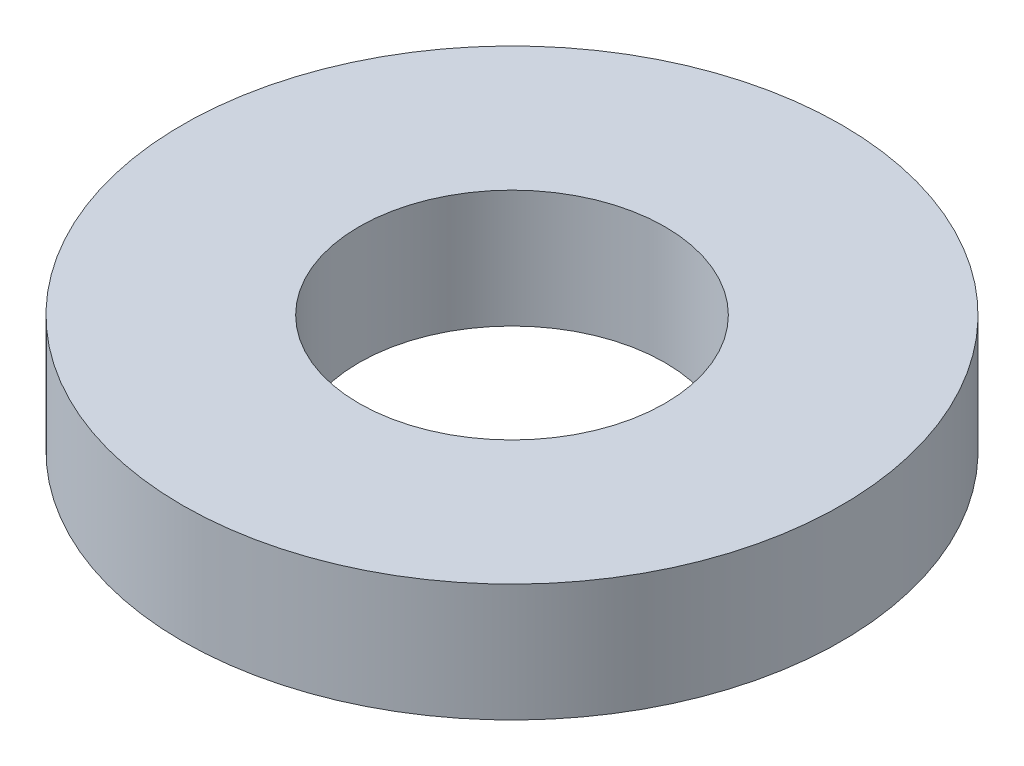
ISO-10303-21;
HEADER;
FILE_DESCRIPTION(('STEP AP214'),'2;1');
FILE_NAME('part.step','',(''),(''),'','','');
FILE_SCHEMA(('AUTOMOTIVE_DESIGN { 1 0 10303 214 1 1 1 1 }'));
ENDSEC;
DATA;
#1=APPLICATION_CONTEXT('core data for automotive mechanical design processes');
#2=APPLICATION_PROTOCOL_DEFINITION('international standard','automotive_design',2000,#1);
#3=PRODUCT_CONTEXT('',#1,'mechanical');
#4=PRODUCT('Part','Part','',(#3));
#5=PRODUCT_RELATED_PRODUCT_CATEGORY('part','',(#4));
#6=PRODUCT_DEFINITION_FORMATION('','',#4);
#7=PRODUCT_DEFINITION_CONTEXT('part definition',#1,'design');
#8=PRODUCT_DEFINITION('design','',#6,#7);
#9=PRODUCT_DEFINITION_SHAPE('','',#8);
#10=(LENGTH_UNIT() NAMED_UNIT(*) SI_UNIT(.MILLI.,.METRE.));
#11=(NAMED_UNIT(*) PLANE_ANGLE_UNIT() SI_UNIT($,.RADIAN.));
#12=(NAMED_UNIT(*) SI_UNIT($,.STERADIAN.) SOLID_ANGLE_UNIT());
#13=UNCERTAINTY_MEASURE_WITH_UNIT(LENGTH_MEASURE(1.E-05),#10,'distance_accuracy_value','');
#14=(GEOMETRIC_REPRESENTATION_CONTEXT(3) GLOBAL_UNCERTAINTY_ASSIGNED_CONTEXT((#13)) GLOBAL_UNIT_ASSIGNED_CONTEXT((#10,
#11,#12)) REPRESENTATION_CONTEXT('',''));
#15=CARTESIAN_POINT('',(0.,0.,0.));
#16=DIRECTION('',(0.,0.,1.));
#17=DIRECTION('',(1.,0.,0.));
#18=AXIS2_PLACEMENT_3D('',#15,#16,#17);
#19=CARTESIAN_POINT('',(0.,2.,0.));
#20=DIRECTION('',(0.,1.,0.));
#21=DIRECTION('',(0.,0.,1.));
#22=AXIS2_PLACEMENT_3D('',#19,#20,#21);
#23=PLANE('',#22);
#24=CARTESIAN_POINT('',(0.,2.,0.));
#25=DIRECTION('',(0.,1.,0.));
#26=DIRECTION('',(0.,0.,1.));
#27=AXIS2_PLACEMENT_3D('',#24,#25,#26);
#28=CIRCLE('',#27,5.6);
#29=CARTESIAN_POINT('',(0.,2.,5.6));
#30=VERTEX_POINT('',#29);
#31=EDGE_CURVE('E10',#30,#30,#28,.T.);
#32=ORIENTED_EDGE('',*,*,#31,.T.);
#33=EDGE_LOOP('',(#32));
#34=FACE_BOUND('',#33,.T.);
#35=CARTESIAN_POINT('',(0.,2.,0.));
#36=DIRECTION('',(0.,1.,0.));
#37=DIRECTION('',(0.,0.,1.));
#38=AXIS2_PLACEMENT_3D('',#35,#36,#37);
#39=CIRCLE('',#38,2.6);
#40=CARTESIAN_POINT('',(0.,2.,2.6));
#41=VERTEX_POINT('',#40);
#42=EDGE_CURVE('E50',#41,#41,#39,.T.);
#43=ORIENTED_EDGE('',*,*,#42,.F.);
#44=EDGE_LOOP('',(#43));
#45=FACE_BOUND('',#44,.T.);
#46=ADVANCED_FACE('F37',(#34,#45),#23,.T.);
#47=CARTESIAN_POINT('',(0.,0.,0.));
#48=DIRECTION('',(0.,1.,0.));
#49=DIRECTION('',(0.,0.,1.));
#50=AXIS2_PLACEMENT_3D('',#47,#48,#49);
#51=PLANE('',#50);
#52=CARTESIAN_POINT('',(0.,0.,0.));
#53=DIRECTION('',(0.,1.,0.));
#54=DIRECTION('',(0.,0.,1.));
#55=AXIS2_PLACEMENT_3D('',#52,#53,#54);
#56=CIRCLE('',#55,5.6);
#57=CARTESIAN_POINT('',(0.,0.,5.6));
#58=VERTEX_POINT('',#57);
#59=EDGE_CURVE('E41',#58,#58,#56,.T.);
#60=ORIENTED_EDGE('',*,*,#59,.F.);
#61=EDGE_LOOP('',(#60));
#62=FACE_BOUND('',#61,.T.);
#63=CARTESIAN_POINT('',(0.,0.,0.));
#64=DIRECTION('',(0.,1.,0.));
#65=DIRECTION('',(0.,0.,1.));
#66=AXIS2_PLACEMENT_3D('',#63,#64,#65);
#67=CIRCLE('',#66,2.6);
#68=CARTESIAN_POINT('',(0.,0.,2.6));
#69=VERTEX_POINT('',#68);
#70=EDGE_CURVE('E52',#69,#69,#67,.T.);
#71=ORIENTED_EDGE('',*,*,#70,.T.);
#72=EDGE_LOOP('',(#71));
#73=FACE_BOUND('',#72,.T.);
#74=ADVANCED_FACE('F64',(#62,#73),#51,.F.);
#75=CARTESIAN_POINT('',(0.,2.,0.));
#76=DIRECTION('',(0.,-1.,0.));
#77=DIRECTION('',(0.,0.,-1.));
#78=AXIS2_PLACEMENT_3D('',#75,#76,#77);
#79=CYLINDRICAL_SURFACE('',#78,5.6);
#80=ORIENTED_EDGE('',*,*,#31,.F.);
#81=EDGE_LOOP('',(#80));
#82=FACE_BOUND('',#81,.T.);
#83=ORIENTED_EDGE('',*,*,#59,.T.);
#84=EDGE_LOOP('',(#83));
#85=FACE_BOUND('',#84,.T.);
#86=ADVANCED_FACE('F39',(#82,#85),#79,.T.);
#87=CARTESIAN_POINT('',(0.,2.,0.));
#88=DIRECTION('',(0.,-1.,0.));
#89=DIRECTION('',(0.,0.,-1.));
#90=AXIS2_PLACEMENT_3D('',#87,#88,#89);
#91=CYLINDRICAL_SURFACE('',#90,2.6);
#92=ORIENTED_EDGE('',*,*,#42,.T.);
#93=EDGE_LOOP('',(#92));
#94=FACE_BOUND('',#93,.T.);
#95=ORIENTED_EDGE('',*,*,#70,.F.);
#96=EDGE_LOOP('',(#95));
#97=FACE_BOUND('',#96,.T.);
#98=ADVANCED_FACE('F60',(#94,#97),#91,.F.);
#99=CLOSED_SHELL('',(#46,#74,#86,#98));
#100=MANIFOLD_SOLID_BREP('B2',#99);
#101=ADVANCED_BREP_SHAPE_REPRESENTATION('',(#18,#100),#14);
#102=SHAPE_DEFINITION_REPRESENTATION(#9,#101);
ENDSEC;
END-ISO-10303-21;
